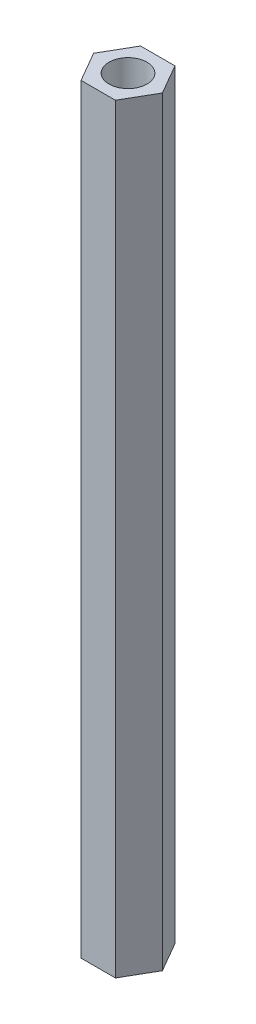
ISO-10303-21;
HEADER;
FILE_DESCRIPTION(('STEP AP214'),'2;1');
FILE_NAME('part.step','',(''),(''),'','','');
FILE_SCHEMA(('AUTOMOTIVE_DESIGN { 1 0 10303 214 1 1 1 1 }'));
ENDSEC;
DATA;
#1=APPLICATION_CONTEXT('core data for automotive mechanical design processes');
#2=APPLICATION_PROTOCOL_DEFINITION('international standard','automotive_design',2000,#1);
#3=PRODUCT_CONTEXT('',#1,'mechanical');
#4=PRODUCT('Part','Part','',(#3));
#5=PRODUCT_RELATED_PRODUCT_CATEGORY('part','',(#4));
#6=PRODUCT_DEFINITION_FORMATION('','',#4);
#7=PRODUCT_DEFINITION_CONTEXT('part definition',#1,'design');
#8=PRODUCT_DEFINITION('design','',#6,#7);
#9=PRODUCT_DEFINITION_SHAPE('','',#8);
#10=(LENGTH_UNIT() NAMED_UNIT(*) SI_UNIT(.MILLI.,.METRE.));
#11=(NAMED_UNIT(*) PLANE_ANGLE_UNIT() SI_UNIT($,.RADIAN.));
#12=(NAMED_UNIT(*) SI_UNIT($,.STERADIAN.) SOLID_ANGLE_UNIT());
#13=UNCERTAINTY_MEASURE_WITH_UNIT(LENGTH_MEASURE(1.E-05),#10,'distance_accuracy_value','');
#14=(GEOMETRIC_REPRESENTATION_CONTEXT(3) GLOBAL_UNCERTAINTY_ASSIGNED_CONTEXT((#13)) GLOBAL_UNIT_ASSIGNED_CONTEXT((#10,
#11,#12)) REPRESENTATION_CONTEXT('',''));
#15=CARTESIAN_POINT('',(0.,0.,0.));
#16=DIRECTION('',(0.,0.,1.));
#17=DIRECTION('',(1.,0.,0.));
#18=AXIS2_PLACEMENT_3D('',#15,#16,#17);
#19=CARTESIAN_POINT('',(0.,60.,0.));
#20=DIRECTION('',(0.,1.,0.));
#21=DIRECTION('',(0.,0.,1.));
#22=AXIS2_PLACEMENT_3D('',#19,#20,#21);
#23=PLANE('',#22);
#24=DIRECTION('',(0.5,0.,-0.866025403784439));
#25=VECTOR('',#24,1.);
#26=CARTESIAN_POINT('',(1.35677313259562,60.,2.35));
#27=LINE('',#26,#25);
#28=CARTESIAN_POINT('',(1.35677313259562,60.,2.35));
#29=VERTEX_POINT('',#28);
#30=CARTESIAN_POINT('',(2.71354626519124,60.,0.));
#31=VERTEX_POINT('',#30);
#32=EDGE_CURVE('E131',#29,#31,#27,.T.);
#33=ORIENTED_EDGE('',*,*,#32,.T.);
#34=DIRECTION('',(-0.5,0.,-0.866025403784439));
#35=VECTOR('',#34,1.);
#36=CARTESIAN_POINT('',(2.71354626519124,60.,0.));
#37=LINE('',#36,#35);
#38=CARTESIAN_POINT('',(1.35677313259562,60.,-2.35));
#39=VERTEX_POINT('',#38);
#40=EDGE_CURVE('E89',#31,#39,#37,.T.);
#41=ORIENTED_EDGE('',*,*,#40,.T.);
#42=DIRECTION('',(-1.,0.,0.));
#43=VECTOR('',#42,1.);
#44=CARTESIAN_POINT('',(1.35677313259562,60.,-2.35));
#45=LINE('',#44,#43);
#46=CARTESIAN_POINT('',(-1.35677313259562,60.,-2.35));
#47=VERTEX_POINT('',#46);
#48=EDGE_CURVE('E102',#39,#47,#45,.T.);
#49=ORIENTED_EDGE('',*,*,#48,.T.);
#50=DIRECTION('',(-0.5,0.,0.866025403784439));
#51=VECTOR('',#50,1.);
#52=CARTESIAN_POINT('',(-1.35677313259562,60.,-2.35));
#53=LINE('',#52,#51);
#54=CARTESIAN_POINT('',(-2.71354626519124,60.,0.));
#55=VERTEX_POINT('',#54);
#56=EDGE_CURVE('E96',#47,#55,#53,.T.);
#57=ORIENTED_EDGE('',*,*,#56,.T.);
#58=DIRECTION('',(0.5,0.,0.866025403784439));
#59=VECTOR('',#58,1.);
#60=CARTESIAN_POINT('',(-2.71354626519124,60.,0.));
#61=LINE('',#60,#59);
#62=CARTESIAN_POINT('',(-1.35677313259562,60.,2.35));
#63=VERTEX_POINT('',#62);
#64=EDGE_CURVE('E100',#55,#63,#61,.T.);
#65=ORIENTED_EDGE('',*,*,#64,.T.);
#66=DIRECTION('',(1.,0.,0.));
#67=VECTOR('',#66,1.);
#68=CARTESIAN_POINT('',(-1.35677313259562,60.,2.35));
#69=LINE('',#68,#67);
#70=EDGE_CURVE('E52',#63,#29,#69,.T.);
#71=ORIENTED_EDGE('',*,*,#70,.T.);
#72=EDGE_LOOP('',(#33,#41,#49,#57,#65,#71));
#73=FACE_BOUND('',#72,.T.);
#74=CARTESIAN_POINT('',(0.,60.,0.));
#75=DIRECTION('',(0.,1.,0.));
#76=DIRECTION('',(0.,0.,1.));
#77=AXIS2_PLACEMENT_3D('',#74,#75,#76);
#78=CIRCLE('',#77,1.5);
#79=CARTESIAN_POINT('',(0.,60.,1.5));
#80=VERTEX_POINT('',#79);
#81=EDGE_CURVE('E124',#80,#80,#78,.T.);
#82=ORIENTED_EDGE('',*,*,#81,.F.);
#83=EDGE_LOOP('',(#82));
#84=FACE_BOUND('',#83,.T.);
#85=ADVANCED_FACE('F35',(#73,#84),#23,.T.);
#86=CARTESIAN_POINT('',(0.,0.,0.));
#87=DIRECTION('',(0.,1.,0.));
#88=DIRECTION('',(0.,0.,1.));
#89=AXIS2_PLACEMENT_3D('',#86,#87,#88);
#90=PLANE('',#89);
#91=DIRECTION('',(0.5,0.,-0.866025403784439));
#92=VECTOR('',#91,1.);
#93=CARTESIAN_POINT('',(1.35677313259562,0.,2.35));
#94=LINE('',#93,#92);
#95=CARTESIAN_POINT('',(1.35677313259562,0.,2.35));
#96=VERTEX_POINT('',#95);
#97=CARTESIAN_POINT('',(2.71354626519124,0.,0.));
#98=VERTEX_POINT('',#97);
#99=EDGE_CURVE('E120',#96,#98,#94,.T.);
#100=ORIENTED_EDGE('',*,*,#99,.F.);
#101=DIRECTION('',(1.,0.,0.));
#102=VECTOR('',#101,1.);
#103=CARTESIAN_POINT('',(-1.35677313259562,0.,2.35));
#104=LINE('',#103,#102);
#105=CARTESIAN_POINT('',(-1.35677313259562,0.,2.35));
#106=VERTEX_POINT('',#105);
#107=EDGE_CURVE('E81',#106,#96,#104,.T.);
#108=ORIENTED_EDGE('',*,*,#107,.F.);
#109=DIRECTION('',(0.5,0.,0.866025403784439));
#110=VECTOR('',#109,1.);
#111=CARTESIAN_POINT('',(-2.71354626519124,0.,0.));
#112=LINE('',#111,#110);
#113=CARTESIAN_POINT('',(-2.71354626519124,0.,0.));
#114=VERTEX_POINT('',#113);
#115=EDGE_CURVE('E75',#114,#106,#112,.T.);
#116=ORIENTED_EDGE('',*,*,#115,.F.);
#117=DIRECTION('',(-0.5,0.,0.866025403784439));
#118=VECTOR('',#117,1.);
#119=CARTESIAN_POINT('',(-1.35677313259562,0.,-2.35));
#120=LINE('',#119,#118);
#121=CARTESIAN_POINT('',(-1.35677313259562,0.,-2.35));
#122=VERTEX_POINT('',#121);
#123=EDGE_CURVE('E110',#122,#114,#120,.T.);
#124=ORIENTED_EDGE('',*,*,#123,.F.);
#125=DIRECTION('',(-1.,0.,0.));
#126=VECTOR('',#125,1.);
#127=CARTESIAN_POINT('',(1.35677313259562,0.,-2.35));
#128=LINE('',#127,#126);
#129=CARTESIAN_POINT('',(1.35677313259562,0.,-2.35));
#130=VERTEX_POINT('',#129);
#131=EDGE_CURVE('E126',#130,#122,#128,.T.);
#132=ORIENTED_EDGE('',*,*,#131,.F.);
#133=DIRECTION('',(-0.5,0.,-0.866025403784439));
#134=VECTOR('',#133,1.);
#135=CARTESIAN_POINT('',(2.71354626519124,0.,0.));
#136=LINE('',#135,#134);
#137=EDGE_CURVE('E123',#98,#130,#136,.T.);
#138=ORIENTED_EDGE('',*,*,#137,.F.);
#139=EDGE_LOOP('',(#100,#108,#116,#124,#132,#138));
#140=FACE_BOUND('',#139,.T.);
#141=CARTESIAN_POINT('',(0.,0.,0.));
#142=DIRECTION('',(0.,1.,0.));
#143=DIRECTION('',(0.,0.,1.));
#144=AXIS2_PLACEMENT_3D('',#141,#142,#143);
#145=CIRCLE('',#144,1.5);
#146=CARTESIAN_POINT('',(0.,0.,1.5));
#147=VERTEX_POINT('',#146);
#148=EDGE_CURVE('E224',#147,#147,#145,.T.);
#149=ORIENTED_EDGE('',*,*,#148,.T.);
#150=EDGE_LOOP('',(#149));
#151=FACE_BOUND('',#150,.T.);
#152=ADVANCED_FACE('F140',(#140,#151),#90,.F.);
#153=CARTESIAN_POINT('',(1.35677313259562,60.,2.35));
#154=DIRECTION('',(-0.866025403784439,0.,-0.5));
#155=DIRECTION('',(-0.5,0.,0.866025403784439));
#156=AXIS2_PLACEMENT_3D('',#153,#154,#155);
#157=PLANE('',#156);
#158=ORIENTED_EDGE('',*,*,#99,.T.);
#159=DIRECTION('',(0.,-1.,0.));
#160=VECTOR('',#159,1.);
#161=CARTESIAN_POINT('',(2.71354626519124,60.,0.));
#162=LINE('',#161,#160);
#163=EDGE_CURVE('E11',#31,#98,#162,.T.);
#164=ORIENTED_EDGE('',*,*,#163,.F.);
#165=ORIENTED_EDGE('',*,*,#32,.F.);
#166=DIRECTION('',(0.,-1.,0.));
#167=VECTOR('',#166,1.);
#168=CARTESIAN_POINT('',(1.35677313259562,60.,2.35));
#169=LINE('',#168,#167);
#170=EDGE_CURVE('E116',#29,#96,#169,.T.);
#171=ORIENTED_EDGE('',*,*,#170,.T.);
#172=EDGE_LOOP('',(#158,#164,#165,#171));
#173=FACE_BOUND('',#172,.T.);
#174=ADVANCED_FACE('F37',(#173),#157,.F.);
#175=CARTESIAN_POINT('',(2.71354626519124,60.,0.));
#176=DIRECTION('',(-0.866025403784439,0.,0.5));
#177=DIRECTION('',(0.5,0.,0.866025403784439));
#178=AXIS2_PLACEMENT_3D('',#175,#176,#177);
#179=PLANE('',#178);
#180=ORIENTED_EDGE('',*,*,#137,.T.);
#181=DIRECTION('',(0.,-1.,0.));
#182=VECTOR('',#181,1.);
#183=CARTESIAN_POINT('',(1.35677313259562,60.,-2.35));
#184=LINE('',#183,#182);
#185=EDGE_CURVE('E44',#39,#130,#184,.T.);
#186=ORIENTED_EDGE('',*,*,#185,.F.);
#187=ORIENTED_EDGE('',*,*,#40,.F.);
#188=ORIENTED_EDGE('',*,*,#163,.T.);
#189=EDGE_LOOP('',(#180,#186,#187,#188));
#190=FACE_BOUND('',#189,.T.);
#191=ADVANCED_FACE('F165',(#190),#179,.F.);
#192=CARTESIAN_POINT('',(1.35677313259562,60.,-2.35));
#193=DIRECTION('',(0.,0.,1.));
#194=DIRECTION('',(1.,0.,0.));
#195=AXIS2_PLACEMENT_3D('',#192,#193,#194);
#196=PLANE('',#195);
#197=ORIENTED_EDGE('',*,*,#131,.T.);
#198=DIRECTION('',(0.,-1.,0.));
#199=VECTOR('',#198,1.);
#200=CARTESIAN_POINT('',(-1.35677313259562,60.,-2.35));
#201=LINE('',#200,#199);
#202=EDGE_CURVE('E111',#47,#122,#201,.T.);
#203=ORIENTED_EDGE('',*,*,#202,.F.);
#204=ORIENTED_EDGE('',*,*,#48,.F.);
#205=ORIENTED_EDGE('',*,*,#185,.T.);
#206=EDGE_LOOP('',(#197,#203,#204,#205));
#207=FACE_BOUND('',#206,.T.);
#208=ADVANCED_FACE('F137',(#207),#196,.F.);
#209=CARTESIAN_POINT('',(-1.35677313259562,60.,-2.35));
#210=DIRECTION('',(0.866025403784439,0.,0.5));
#211=DIRECTION('',(0.5,0.,-0.866025403784439));
#212=AXIS2_PLACEMENT_3D('',#209,#210,#211);
#213=PLANE('',#212);
#214=ORIENTED_EDGE('',*,*,#123,.T.);
#215=DIRECTION('',(0.,-1.,0.));
#216=VECTOR('',#215,1.);
#217=CARTESIAN_POINT('',(-2.71354626519124,60.,0.));
#218=LINE('',#217,#216);
#219=EDGE_CURVE('E107',#55,#114,#218,.T.);
#220=ORIENTED_EDGE('',*,*,#219,.F.);
#221=ORIENTED_EDGE('',*,*,#56,.F.);
#222=ORIENTED_EDGE('',*,*,#202,.T.);
#223=EDGE_LOOP('',(#214,#220,#221,#222));
#224=FACE_BOUND('',#223,.T.);
#225=ADVANCED_FACE('F108',(#224),#213,.F.);
#226=CARTESIAN_POINT('',(-2.71354626519124,60.,0.));
#227=DIRECTION('',(0.866025403784439,0.,-0.5));
#228=DIRECTION('',(-0.5,0.,-0.866025403784439));
#229=AXIS2_PLACEMENT_3D('',#226,#227,#228);
#230=PLANE('',#229);
#231=ORIENTED_EDGE('',*,*,#115,.T.);
#232=DIRECTION('',(0.,-1.,0.));
#233=VECTOR('',#232,1.);
#234=CARTESIAN_POINT('',(-1.35677313259562,60.,2.35));
#235=LINE('',#234,#233);
#236=EDGE_CURVE('E112',#63,#106,#235,.T.);
#237=ORIENTED_EDGE('',*,*,#236,.F.);
#238=ORIENTED_EDGE('',*,*,#64,.F.);
#239=ORIENTED_EDGE('',*,*,#219,.T.);
#240=EDGE_LOOP('',(#231,#237,#238,#239));
#241=FACE_BOUND('',#240,.T.);
#242=ADVANCED_FACE('F114',(#241),#230,.F.);
#243=CARTESIAN_POINT('',(-1.35677313259562,60.,2.35));
#244=DIRECTION('',(0.,0.,-1.));
#245=DIRECTION('',(-1.,0.,0.));
#246=AXIS2_PLACEMENT_3D('',#243,#244,#245);
#247=PLANE('',#246);
#248=ORIENTED_EDGE('',*,*,#107,.T.);
#249=ORIENTED_EDGE('',*,*,#170,.F.);
#250=ORIENTED_EDGE('',*,*,#70,.F.);
#251=ORIENTED_EDGE('',*,*,#236,.T.);
#252=EDGE_LOOP('',(#248,#249,#250,#251));
#253=FACE_BOUND('',#252,.T.);
#254=ADVANCED_FACE('F145',(#253),#247,.F.);
#255=CARTESIAN_POINT('',(0.,60.,0.));
#256=DIRECTION('',(0.,-1.,0.));
#257=DIRECTION('',(0.,0.,-1.));
#258=AXIS2_PLACEMENT_3D('',#255,#256,#257);
#259=CYLINDRICAL_SURFACE('',#258,1.5);
#260=ORIENTED_EDGE('',*,*,#81,.T.);
#261=EDGE_LOOP('',(#260));
#262=FACE_BOUND('',#261,.T.);
#263=ORIENTED_EDGE('',*,*,#148,.F.);
#264=EDGE_LOOP('',(#263));
#265=FACE_BOUND('',#264,.T.);
#266=ADVANCED_FACE('F147',(#262,#265),#259,.F.);
#267=CLOSED_SHELL('',(#85,#152,#174,#191,#208,#225,#242,#254,#266));
#268=MANIFOLD_SOLID_BREP('B2',#267);
#269=ADVANCED_BREP_SHAPE_REPRESENTATION('',(#18,#268),#14);
#270=SHAPE_DEFINITION_REPRESENTATION(#9,#269);
ENDSEC;
END-ISO-10303-21;
